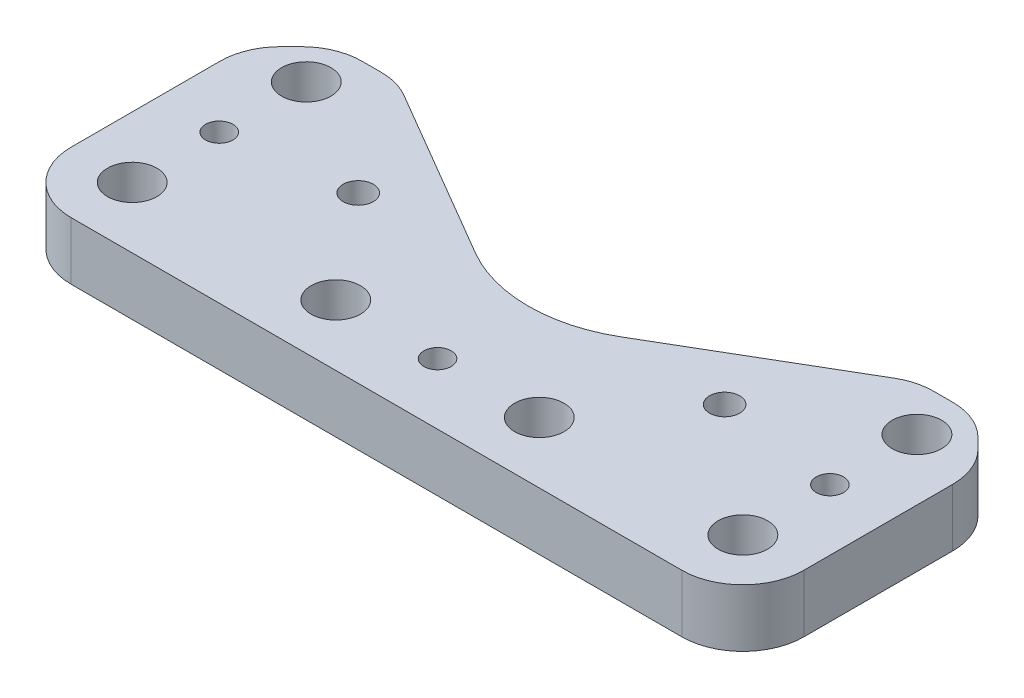
ISO-10303-21;
HEADER;
FILE_DESCRIPTION(('STEP AP214'),'2;1');
FILE_NAME('part.step','',(''),(''),'','','');
FILE_SCHEMA(('AUTOMOTIVE_DESIGN { 1 0 10303 214 1 1 1 1 }'));
ENDSEC;
DATA;
#1=APPLICATION_CONTEXT('core data for automotive mechanical design processes');
#2=APPLICATION_PROTOCOL_DEFINITION('international standard','automotive_design',2000,#1);
#3=PRODUCT_CONTEXT('',#1,'mechanical');
#4=PRODUCT('Part','Part','',(#3));
#5=PRODUCT_RELATED_PRODUCT_CATEGORY('part','',(#4));
#6=PRODUCT_DEFINITION_FORMATION('','',#4);
#7=PRODUCT_DEFINITION_CONTEXT('part definition',#1,'design');
#8=PRODUCT_DEFINITION('design','',#6,#7);
#9=PRODUCT_DEFINITION_SHAPE('','',#8);
#10=(LENGTH_UNIT() NAMED_UNIT(*) SI_UNIT(.MILLI.,.METRE.));
#11=(NAMED_UNIT(*) PLANE_ANGLE_UNIT() SI_UNIT($,.RADIAN.));
#12=(NAMED_UNIT(*) SI_UNIT($,.STERADIAN.) SOLID_ANGLE_UNIT());
#13=UNCERTAINTY_MEASURE_WITH_UNIT(LENGTH_MEASURE(1.E-05),#10,'distance_accuracy_value','');
#14=(GEOMETRIC_REPRESENTATION_CONTEXT(3) GLOBAL_UNCERTAINTY_ASSIGNED_CONTEXT((#13)) GLOBAL_UNIT_ASSIGNED_CONTEXT((#10,
#11,#12)) REPRESENTATION_CONTEXT('',''));
#15=CARTESIAN_POINT('',(0.,0.,0.));
#16=DIRECTION('',(0.,0.,1.));
#17=DIRECTION('',(1.,0.,0.));
#18=AXIS2_PLACEMENT_3D('',#15,#16,#17);
#19=CARTESIAN_POINT('',(38.1,6.,-30.8));
#20=DIRECTION('',(0.,-1.,0.));
#21=DIRECTION('',(0.,0.,-1.));
#22=AXIS2_PLACEMENT_3D('',#19,#20,#21);
#23=CYLINDRICAL_SURFACE('',#22,15.);
#24=DIRECTION('',(0.,-1.,0.));
#25=VECTOR('',#24,1.);
#26=CARTESIAN_POINT('',(30.5243607433017,6.,-17.8535838993036));
#27=LINE('',#26,#25);
#28=CARTESIAN_POINT('',(30.5243607433017,6.,-17.8535838993036));
#29=VERTEX_POINT('',#28);
#30=CARTESIAN_POINT('',(30.5243607433017,0.,-17.8535838993036));
#31=VERTEX_POINT('',#30);
#32=EDGE_CURVE('E174',#29,#31,#27,.T.);
#33=ORIENTED_EDGE('',*,*,#32,.F.);
#34=CARTESIAN_POINT('',(38.1,6.,-30.8));
#35=DIRECTION('',(0.,1.,0.));
#36=DIRECTION('',(0.,0.,1.));
#37=AXIS2_PLACEMENT_3D('',#34,#35,#36);
#38=CIRCLE('',#37,15.);
#39=CARTESIAN_POINT('',(45.6756392566983,6.,-17.8535838993036));
#40=VERTEX_POINT('',#39);
#41=EDGE_CURVE('E183',#29,#40,#38,.T.);
#42=ORIENTED_EDGE('',*,*,#41,.T.);
#43=DIRECTION('',(0.,-1.,0.));
#44=VECTOR('',#43,1.);
#45=CARTESIAN_POINT('',(45.6756392566983,6.,-17.8535838993036));
#46=LINE('',#45,#44);
#47=CARTESIAN_POINT('',(45.6756392566983,0.,-17.8535838993036));
#48=VERTEX_POINT('',#47);
#49=EDGE_CURVE('E163',#40,#48,#46,.T.);
#50=ORIENTED_EDGE('',*,*,#49,.T.);
#51=CARTESIAN_POINT('',(38.1,0.,-30.8));
#52=DIRECTION('',(0.,1.,0.));
#53=DIRECTION('',(0.,0.,1.));
#54=AXIS2_PLACEMENT_3D('',#51,#52,#53);
#55=CIRCLE('',#54,15.);
#56=EDGE_CURVE('E191',#31,#48,#55,.T.);
#57=ORIENTED_EDGE('',*,*,#56,.F.);
#58=EDGE_LOOP('',(#33,#42,#50,#57));
#59=FACE_BOUND('',#58,.T.);
#60=ADVANCED_FACE('F35',(#59),#23,.F.);
#61=CARTESIAN_POINT('',(0.,6.,-50.8));
#62=DIRECTION('',(0.,-1.,0.));
#63=DIRECTION('',(0.,0.,-1.));
#64=AXIS2_PLACEMENT_3D('',#61,#62,#63);
#65=PLANE('',#64);
#66=CARTESIAN_POINT('',(69.85,6.,-15.4));
#67=DIRECTION('',(0.,-1.,0.));
#68=DIRECTION('',(0.,0.,-1.));
#69=AXIS2_PLACEMENT_3D('',#66,#67,#68);
#70=CIRCLE('',#69,1.42);
#71=CARTESIAN_POINT('',(69.85,6.,-16.82));
#72=VERTEX_POINT('',#71);
#73=EDGE_CURVE('E296',#72,#72,#70,.F.);
#74=ORIENTED_EDGE('',*,*,#73,.F.);
#75=EDGE_LOOP('',(#74));
#76=FACE_BOUND('',#75,.T.);
#77=CARTESIAN_POINT('',(38.1,6.,-6.34999999999999));
#78=DIRECTION('',(0.,-1.,0.));
#79=DIRECTION('',(0.,0.,-1.));
#80=AXIS2_PLACEMENT_3D('',#77,#78,#79);
#81=CIRCLE('',#80,1.42);
#82=CARTESIAN_POINT('',(38.1,6.,-7.77));
#83=VERTEX_POINT('',#82);
#84=EDGE_CURVE('E295',#83,#83,#81,.F.);
#85=ORIENTED_EDGE('',*,*,#84,.F.);
#86=EDGE_LOOP('',(#85));
#87=FACE_BOUND('',#86,.T.);
#88=CARTESIAN_POINT('',(6.35,6.,-15.4));
#89=DIRECTION('',(0.,-1.,0.));
#90=DIRECTION('',(0.,0.,-1.));
#91=AXIS2_PLACEMENT_3D('',#88,#89,#90);
#92=CIRCLE('',#91,1.42);
#93=CARTESIAN_POINT('',(6.35,6.,-16.82));
#94=VERTEX_POINT('',#93);
#95=EDGE_CURVE('E302',#94,#94,#92,.F.);
#96=ORIENTED_EDGE('',*,*,#95,.F.);
#97=EDGE_LOOP('',(#96));
#98=FACE_BOUND('',#97,.T.);
#99=CARTESIAN_POINT('',(69.85,6.,-6.34999999999999));
#100=DIRECTION('',(0.,-1.,0.));
#101=DIRECTION('',(0.,0.,-1.));
#102=AXIS2_PLACEMENT_3D('',#99,#100,#101);
#103=CIRCLE('',#102,2.57);
#104=CARTESIAN_POINT('',(69.85,6.,-8.91999999999999));
#105=VERTEX_POINT('',#104);
#106=EDGE_CURVE('E312',#105,#105,#103,.T.);
#107=ORIENTED_EDGE('',*,*,#106,.T.);
#108=EDGE_LOOP('',(#107));
#109=FACE_BOUND('',#108,.T.);
#110=CARTESIAN_POINT('',(27.5166666666667,6.,-6.34999999999999));
#111=DIRECTION('',(0.,-1.,0.));
#112=DIRECTION('',(0.,0.,-1.));
#113=AXIS2_PLACEMENT_3D('',#110,#111,#112);
#114=CIRCLE('',#113,2.57);
#115=CARTESIAN_POINT('',(27.5166666666667,6.,-8.91999999999999));
#116=VERTEX_POINT('',#115);
#117=EDGE_CURVE('E326',#116,#116,#114,.T.);
#118=ORIENTED_EDGE('',*,*,#117,.T.);
#119=EDGE_LOOP('',(#118));
#120=FACE_BOUND('',#119,.T.);
#121=CARTESIAN_POINT('',(6.35000000000001,6.,-24.45));
#122=DIRECTION('',(0.,-1.,0.));
#123=DIRECTION('',(0.,0.,-1.));
#124=AXIS2_PLACEMENT_3D('',#121,#122,#123);
#125=CIRCLE('',#124,2.57);
#126=CARTESIAN_POINT('',(6.35000000000001,6.,-27.02));
#127=VERTEX_POINT('',#126);
#128=EDGE_CURVE('E288',#127,#127,#125,.T.);
#129=ORIENTED_EDGE('',*,*,#128,.T.);
#130=EDGE_LOOP('',(#129));
#131=FACE_BOUND('',#130,.T.);
#132=CARTESIAN_POINT('',(57.15,6.,-17.15));
#133=DIRECTION('',(0.,-1.,0.));
#134=DIRECTION('',(0.,0.,-1.));
#135=AXIS2_PLACEMENT_3D('',#132,#133,#134);
#136=CIRCLE('',#135,1.57);
#137=CARTESIAN_POINT('',(57.15,6.,-18.72));
#138=VERTEX_POINT('',#137);
#139=EDGE_CURVE('E287',#138,#138,#136,.F.);
#140=ORIENTED_EDGE('',*,*,#139,.F.);
#141=EDGE_LOOP('',(#140));
#142=FACE_BOUND('',#141,.T.);
#143=CARTESIAN_POINT('',(19.05,6.,-17.15));
#144=DIRECTION('',(0.,-1.,0.));
#145=DIRECTION('',(0.,0.,-1.));
#146=AXIS2_PLACEMENT_3D('',#143,#144,#145);
#147=CIRCLE('',#146,1.57);
#148=CARTESIAN_POINT('',(19.05,6.,-18.72));
#149=VERTEX_POINT('',#148);
#150=EDGE_CURVE('E39',#149,#149,#147,.F.);
#151=ORIENTED_EDGE('',*,*,#150,.F.);
#152=EDGE_LOOP('',(#151));
#153=FACE_BOUND('',#152,.T.);
#154=DIRECTION('',(0.707106781186547,0.,0.707106781186548));
#155=VECTOR('',#154,1.);
#156=CARTESIAN_POINT('',(63.5,6.,-37.15));
#157=LINE('',#156,#155);
#158=CARTESIAN_POINT('',(73.2973719394654,6.,-27.3526280605346));
#159=VERTEX_POINT('',#158);
#160=CARTESIAN_POINT('',(74.3401280605346,6.,-26.3098719394655));
#161=VERTEX_POINT('',#160);
#162=EDGE_CURVE('E199',#159,#161,#157,.T.);
#163=ORIENTED_EDGE('',*,*,#162,.F.);
#164=CARTESIAN_POINT('',(68.8072438789308,6.,-22.8625000000001));
#165=DIRECTION('',(0.,-1.,0.));
#166=DIRECTION('',(0.,0.,-1.));
#167=AXIS2_PLACEMENT_3D('',#164,#165,#166);
#168=CIRCLE('',#167,6.35);
#169=CARTESIAN_POINT('',(68.8072438789308,6.,-29.2125000000001));
#170=VERTEX_POINT('',#169);
#171=EDGE_CURVE('E262',#159,#170,#168,.F.);
#172=ORIENTED_EDGE('',*,*,#171,.T.);
#173=DIRECTION('',(1.,0.,0.));
#174=VECTOR('',#173,1.);
#175=CARTESIAN_POINT('',(71.4375,6.,-29.2125000000001));
#176=LINE('',#175,#174);
#177=CARTESIAN_POINT('',(66.8088409084979,6.,-29.2125000000001));
#178=VERTEX_POINT('',#177);
#179=EDGE_CURVE('E186',#178,#170,#176,.T.);
#180=ORIENTED_EDGE('',*,*,#179,.F.);
#181=CARTESIAN_POINT('',(66.8088409084979,6.,-22.8625000000001));
#182=DIRECTION('',(0.,-1.,0.));
#183=DIRECTION('',(0.,0.,-1.));
#184=AXIS2_PLACEMENT_3D('',#181,#182,#183);
#185=CIRCLE('',#184,6.35);
#186=CARTESIAN_POINT('',(63.601820289829,6.,-28.3431494826282));
#187=VERTEX_POINT('',#186);
#188=EDGE_CURVE('E185',#178,#187,#185,.F.);
#189=ORIENTED_EDGE('',*,*,#188,.T.);
#190=DIRECTION('',(0.863094406713095,0.,-0.505042617113221));
#191=VECTOR('',#190,1.);
#192=CARTESIAN_POINT('',(65.0875,6.,-29.2125000000001));
#193=LINE('',#192,#191);
#194=EDGE_CURVE('E166',#40,#187,#193,.T.);
#195=ORIENTED_EDGE('',*,*,#194,.F.);
#196=ORIENTED_EDGE('',*,*,#41,.F.);
#197=DIRECTION('',(0.863094406713096,0.,0.505042617113219));
#198=VECTOR('',#197,1.);
#199=CARTESIAN_POINT('',(30.5243607433017,6.,-17.8535838993036));
#200=LINE('',#199,#198);
#201=CARTESIAN_POINT('',(12.598179710171,6.,-28.3431494826282));
#202=VERTEX_POINT('',#201);
#203=EDGE_CURVE('E510',#202,#29,#200,.T.);
#204=ORIENTED_EDGE('',*,*,#203,.F.);
#205=CARTESIAN_POINT('',(9.39115909150207,6.,-22.8625));
#206=DIRECTION('',(0.,-1.,0.));
#207=DIRECTION('',(0.,0.,-1.));
#208=AXIS2_PLACEMENT_3D('',#205,#206,#207);
#209=CIRCLE('',#208,6.35);
#210=CARTESIAN_POINT('',(9.39115909150207,6.,-29.2125));
#211=VERTEX_POINT('',#210);
#212=EDGE_CURVE('E258',#202,#211,#209,.F.);
#213=ORIENTED_EDGE('',*,*,#212,.T.);
#214=DIRECTION('',(1.,0.,0.));
#215=VECTOR('',#214,1.);
#216=CARTESIAN_POINT('',(11.1125,6.,-29.2125));
#217=LINE('',#216,#215);
#218=CARTESIAN_POINT('',(7.39275612106917,6.,-29.2125));
#219=VERTEX_POINT('',#218);
#220=EDGE_CURVE('E527',#219,#211,#217,.T.);
#221=ORIENTED_EDGE('',*,*,#220,.F.);
#222=CARTESIAN_POINT('',(7.39275612106916,6.,-22.8625));
#223=DIRECTION('',(0.,-1.,0.));
#224=DIRECTION('',(0.,0.,-1.));
#225=AXIS2_PLACEMENT_3D('',#222,#223,#224);
#226=CIRCLE('',#225,6.35);
#227=CARTESIAN_POINT('',(2.9026280605346,6.,-27.3526280605346));
#228=VERTEX_POINT('',#227);
#229=EDGE_CURVE('E260',#219,#228,#226,.F.);
#230=ORIENTED_EDGE('',*,*,#229,.T.);
#231=DIRECTION('',(0.707106781186549,0.,-0.707106781186547));
#232=VECTOR('',#231,1.);
#233=CARTESIAN_POINT('',(12.7,6.,-37.15));
#234=LINE('',#233,#232);
#235=CARTESIAN_POINT('',(1.85987193946543,6.,-26.3098719394655));
#236=VERTEX_POINT('',#235);
#237=EDGE_CURVE('E345',#236,#228,#234,.T.);
#238=ORIENTED_EDGE('',*,*,#237,.F.);
#239=CARTESIAN_POINT('',(6.35,6.,-21.8197438789309));
#240=DIRECTION('',(0.,-1.,0.));
#241=DIRECTION('',(0.,0.,-1.));
#242=AXIS2_PLACEMENT_3D('',#239,#240,#241);
#243=CIRCLE('',#242,6.35);
#244=CARTESIAN_POINT('',(0.,6.,-21.8197438789309));
#245=VERTEX_POINT('',#244);
#246=EDGE_CURVE('E238',#236,#245,#243,.F.);
#247=ORIENTED_EDGE('',*,*,#246,.T.);
#248=DIRECTION('',(0.,0.,1.));
#249=VECTOR('',#248,1.);
#250=CARTESIAN_POINT('',(0.,6.,0.));
#251=LINE('',#250,#249);
#252=CARTESIAN_POINT('',(0.,6.,-6.35));
#253=VERTEX_POINT('',#252);
#254=EDGE_CURVE('E202',#245,#253,#251,.T.);
#255=ORIENTED_EDGE('',*,*,#254,.T.);
#256=CARTESIAN_POINT('',(6.35,6.,-6.35));
#257=DIRECTION('',(0.,-1.,0.));
#258=DIRECTION('',(0.,0.,-1.));
#259=AXIS2_PLACEMENT_3D('',#256,#257,#258);
#260=CIRCLE('',#259,6.35);
#261=CARTESIAN_POINT('',(6.35,6.,0.));
#262=VERTEX_POINT('',#261);
#263=EDGE_CURVE('E240',#253,#262,#260,.F.);
#264=ORIENTED_EDGE('',*,*,#263,.T.);
#265=DIRECTION('',(1.,0.,0.));
#266=VECTOR('',#265,1.);
#267=CARTESIAN_POINT('',(0.,6.,0.));
#268=LINE('',#267,#266);
#269=CARTESIAN_POINT('',(69.85,6.,0.));
#270=VERTEX_POINT('',#269);
#271=EDGE_CURVE('E205',#262,#270,#268,.T.);
#272=ORIENTED_EDGE('',*,*,#271,.T.);
#273=CARTESIAN_POINT('',(69.85,6.,-6.35));
#274=DIRECTION('',(0.,-1.,0.));
#275=DIRECTION('',(0.,0.,-1.));
#276=AXIS2_PLACEMENT_3D('',#273,#274,#275);
#277=CIRCLE('',#276,6.35);
#278=CARTESIAN_POINT('',(76.2,6.,-6.35));
#279=VERTEX_POINT('',#278);
#280=EDGE_CURVE('E242',#270,#279,#277,.F.);
#281=ORIENTED_EDGE('',*,*,#280,.T.);
#282=DIRECTION('',(0.,0.,-1.));
#283=VECTOR('',#282,1.);
#284=CARTESIAN_POINT('',(76.2,6.,-50.8));
#285=LINE('',#284,#283);
#286=CARTESIAN_POINT('',(76.2,6.,-21.8197438789309));
#287=VERTEX_POINT('',#286);
#288=EDGE_CURVE('E209',#279,#287,#285,.T.);
#289=ORIENTED_EDGE('',*,*,#288,.T.);
#290=CARTESIAN_POINT('',(69.85,6.,-21.8197438789309));
#291=DIRECTION('',(0.,-1.,0.));
#292=DIRECTION('',(0.,0.,-1.));
#293=AXIS2_PLACEMENT_3D('',#290,#291,#292);
#294=CIRCLE('',#293,6.35);
#295=EDGE_CURVE('E235',#287,#161,#294,.F.);
#296=ORIENTED_EDGE('',*,*,#295,.T.);
#297=EDGE_LOOP('',(#163,#172,#180,#189,#195,#196,#204,#213,#221,#230,#238,#247,#255,#264,#272,
#281,#289,#296));
#298=FACE_BOUND('',#297,.T.);
#299=CARTESIAN_POINT('',(6.35,6.,-6.34999999999999));
#300=DIRECTION('',(0.,-1.,0.));
#301=DIRECTION('',(0.,0.,-1.));
#302=AXIS2_PLACEMENT_3D('',#299,#300,#301);
#303=CIRCLE('',#302,2.57);
#304=CARTESIAN_POINT('',(6.35,6.,-8.91999999999999));
#305=VERTEX_POINT('',#304);
#306=EDGE_CURVE('E332',#305,#305,#303,.T.);
#307=ORIENTED_EDGE('',*,*,#306,.T.);
#308=EDGE_LOOP('',(#307));
#309=FACE_BOUND('',#308,.T.);
#310=CARTESIAN_POINT('',(48.6833333333333,6.,-6.34999999999999));
#311=DIRECTION('',(0.,-1.,0.));
#312=DIRECTION('',(0.,0.,-1.));
#313=AXIS2_PLACEMENT_3D('',#310,#311,#312);
#314=CIRCLE('',#313,2.57);
#315=CARTESIAN_POINT('',(48.6833333333333,6.,-8.91999999999999));
#316=VERTEX_POINT('',#315);
#317=EDGE_CURVE('E320',#316,#316,#314,.T.);
#318=ORIENTED_EDGE('',*,*,#317,.T.);
#319=EDGE_LOOP('',(#318));
#320=FACE_BOUND('',#319,.T.);
#321=CARTESIAN_POINT('',(69.85,6.,-24.45));
#322=DIRECTION('',(0.,-1.,0.));
#323=DIRECTION('',(0.,0.,-1.));
#324=AXIS2_PLACEMENT_3D('',#321,#322,#323);
#325=CIRCLE('',#324,2.57);
#326=CARTESIAN_POINT('',(69.85,6.,-27.02));
#327=VERTEX_POINT('',#326);
#328=EDGE_CURVE('E313',#327,#327,#325,.T.);
#329=ORIENTED_EDGE('',*,*,#328,.T.);
#330=EDGE_LOOP('',(#329));
#331=FACE_BOUND('',#330,.T.);
#332=ADVANCED_FACE('F180',(#76,#87,#98,#109,#120,#131,#142,#153,#298,#309,#320,#331),#65,.F.);
#333=CARTESIAN_POINT('',(0.,0.,-50.8));
#334=DIRECTION('',(0.,-1.,0.));
#335=DIRECTION('',(0.,0.,-1.));
#336=AXIS2_PLACEMENT_3D('',#333,#334,#335);
#337=PLANE('',#336);
#338=CARTESIAN_POINT('',(69.85,0.,-15.4));
#339=DIRECTION('',(0.,-1.,0.));
#340=DIRECTION('',(0.,0.,-1.));
#341=AXIS2_PLACEMENT_3D('',#338,#339,#340);
#342=CIRCLE('',#341,1.42);
#343=CARTESIAN_POINT('',(69.85,0.,-16.82));
#344=VERTEX_POINT('',#343);
#345=EDGE_CURVE('E292',#344,#344,#342,.F.);
#346=ORIENTED_EDGE('',*,*,#345,.T.);
#347=EDGE_LOOP('',(#346));
#348=FACE_BOUND('',#347,.T.);
#349=CARTESIAN_POINT('',(38.1,0.,-6.34999999999999));
#350=DIRECTION('',(0.,-1.,0.));
#351=DIRECTION('',(0.,0.,-1.));
#352=AXIS2_PLACEMENT_3D('',#349,#350,#351);
#353=CIRCLE('',#352,1.42);
#354=CARTESIAN_POINT('',(38.1,0.,-7.77));
#355=VERTEX_POINT('',#354);
#356=EDGE_CURVE('E299',#355,#355,#353,.F.);
#357=ORIENTED_EDGE('',*,*,#356,.T.);
#358=EDGE_LOOP('',(#357));
#359=FACE_BOUND('',#358,.T.);
#360=CARTESIAN_POINT('',(6.35,0.,-15.4));
#361=DIRECTION('',(0.,-1.,0.));
#362=DIRECTION('',(0.,0.,-1.));
#363=AXIS2_PLACEMENT_3D('',#360,#361,#362);
#364=CIRCLE('',#363,1.42);
#365=CARTESIAN_POINT('',(6.35,0.,-16.82));
#366=VERTEX_POINT('',#365);
#367=EDGE_CURVE('E187',#366,#366,#364,.F.);
#368=ORIENTED_EDGE('',*,*,#367,.T.);
#369=EDGE_LOOP('',(#368));
#370=FACE_BOUND('',#369,.T.);
#371=DIRECTION('',(-1.,0.,0.));
#372=VECTOR('',#371,1.);
#373=CARTESIAN_POINT('',(0.,0.,-29.2125000000001));
#374=LINE('',#373,#372);
#375=CARTESIAN_POINT('',(68.8072438789308,0.,-29.2125000000001));
#376=VERTEX_POINT('',#375);
#377=CARTESIAN_POINT('',(66.8088409084979,0.,-29.2125000000001));
#378=VERTEX_POINT('',#377);
#379=EDGE_CURVE('E482',#376,#378,#374,.T.);
#380=ORIENTED_EDGE('',*,*,#379,.F.);
#381=CARTESIAN_POINT('',(68.8072438789308,0.,-22.8625000000001));
#382=DIRECTION('',(0.,-1.,0.));
#383=DIRECTION('',(0.,0.,-1.));
#384=AXIS2_PLACEMENT_3D('',#381,#382,#383);
#385=CIRCLE('',#384,6.35);
#386=CARTESIAN_POINT('',(73.2973719394654,0.,-27.3526280605346));
#387=VERTEX_POINT('',#386);
#388=EDGE_CURVE('E274',#376,#387,#385,.T.);
#389=ORIENTED_EDGE('',*,*,#388,.T.);
#390=DIRECTION('',(0.707106781186547,0.,0.707106781186548));
#391=VECTOR('',#390,1.);
#392=CARTESIAN_POINT('',(63.5,0.,-37.15));
#393=LINE('',#392,#391);
#394=CARTESIAN_POINT('',(74.3401280605346,0.,-26.3098719394655));
#395=VERTEX_POINT('',#394);
#396=EDGE_CURVE('E196',#387,#395,#393,.T.);
#397=ORIENTED_EDGE('',*,*,#396,.T.);
#398=CARTESIAN_POINT('',(69.85,0.,-21.8197438789309));
#399=DIRECTION('',(0.,-1.,0.));
#400=DIRECTION('',(0.,0.,-1.));
#401=AXIS2_PLACEMENT_3D('',#398,#399,#400);
#402=CIRCLE('',#401,6.35);
#403=CARTESIAN_POINT('',(76.2,0.,-21.8197438789309));
#404=VERTEX_POINT('',#403);
#405=EDGE_CURVE('E222',#395,#404,#402,.T.);
#406=ORIENTED_EDGE('',*,*,#405,.T.);
#407=DIRECTION('',(0.,0.,-1.));
#408=VECTOR('',#407,1.);
#409=CARTESIAN_POINT('',(76.2,0.,-50.8));
#410=LINE('',#409,#408);
#411=CARTESIAN_POINT('',(76.2,0.,-6.35));
#412=VERTEX_POINT('',#411);
#413=EDGE_CURVE('E206',#412,#404,#410,.T.);
#414=ORIENTED_EDGE('',*,*,#413,.F.);
#415=CARTESIAN_POINT('',(69.85,0.,-6.35));
#416=DIRECTION('',(0.,-1.,0.));
#417=DIRECTION('',(0.,0.,-1.));
#418=AXIS2_PLACEMENT_3D('',#415,#416,#417);
#419=CIRCLE('',#418,6.35);
#420=CARTESIAN_POINT('',(69.85,0.,0.));
#421=VERTEX_POINT('',#420);
#422=EDGE_CURVE('E228',#412,#421,#419,.T.);
#423=ORIENTED_EDGE('',*,*,#422,.T.);
#424=DIRECTION('',(1.,0.,0.));
#425=VECTOR('',#424,1.);
#426=CARTESIAN_POINT('',(0.,0.,0.));
#427=LINE('',#426,#425);
#428=CARTESIAN_POINT('',(6.35,0.,0.));
#429=VERTEX_POINT('',#428);
#430=EDGE_CURVE('E194',#429,#421,#427,.T.);
#431=ORIENTED_EDGE('',*,*,#430,.F.);
#432=CARTESIAN_POINT('',(6.35,0.,-6.35));
#433=DIRECTION('',(0.,-1.,0.));
#434=DIRECTION('',(0.,0.,-1.));
#435=AXIS2_PLACEMENT_3D('',#432,#433,#434);
#436=CIRCLE('',#435,6.35);
#437=CARTESIAN_POINT('',(0.,0.,-6.35));
#438=VERTEX_POINT('',#437);
#439=EDGE_CURVE('E226',#429,#438,#436,.T.);
#440=ORIENTED_EDGE('',*,*,#439,.T.);
#441=DIRECTION('',(0.,0.,1.));
#442=VECTOR('',#441,1.);
#443=CARTESIAN_POINT('',(0.,0.,0.));
#444=LINE('',#443,#442);
#445=CARTESIAN_POINT('',(0.,0.,-21.8197438789309));
#446=VERTEX_POINT('',#445);
#447=EDGE_CURVE('E190',#446,#438,#444,.T.);
#448=ORIENTED_EDGE('',*,*,#447,.F.);
#449=CARTESIAN_POINT('',(6.35,0.,-21.8197438789309));
#450=DIRECTION('',(0.,-1.,0.));
#451=DIRECTION('',(0.,0.,-1.));
#452=AXIS2_PLACEMENT_3D('',#449,#450,#451);
#453=CIRCLE('',#452,6.35);
#454=CARTESIAN_POINT('',(1.85987193946543,0.,-26.3098719394655));
#455=VERTEX_POINT('',#454);
#456=EDGE_CURVE('E224',#446,#455,#453,.T.);
#457=ORIENTED_EDGE('',*,*,#456,.T.);
#458=DIRECTION('',(0.707106781186549,0.,-0.707106781186547));
#459=VECTOR('',#458,1.);
#460=CARTESIAN_POINT('',(12.7,0.,-37.15));
#461=LINE('',#460,#459);
#462=CARTESIAN_POINT('',(2.9026280605346,0.,-27.3526280605346));
#463=VERTEX_POINT('',#462);
#464=EDGE_CURVE('E517',#455,#463,#461,.T.);
#465=ORIENTED_EDGE('',*,*,#464,.T.);
#466=CARTESIAN_POINT('',(7.39275612106916,0.,-22.8625));
#467=DIRECTION('',(0.,-1.,0.));
#468=DIRECTION('',(0.,0.,-1.));
#469=AXIS2_PLACEMENT_3D('',#466,#467,#468);
#470=CIRCLE('',#469,6.35);
#471=CARTESIAN_POINT('',(7.39275612106917,0.,-29.2125));
#472=VERTEX_POINT('',#471);
#473=EDGE_CURVE('E52',#463,#472,#470,.T.);
#474=ORIENTED_EDGE('',*,*,#473,.T.);
#475=DIRECTION('',(-1.,0.,0.));
#476=VECTOR('',#475,1.);
#477=CARTESIAN_POINT('',(0.,0.,-29.2125));
#478=LINE('',#477,#476);
#479=CARTESIAN_POINT('',(9.39115909150207,0.,-29.2125));
#480=VERTEX_POINT('',#479);
#481=EDGE_CURVE('E509',#480,#472,#478,.T.);
#482=ORIENTED_EDGE('',*,*,#481,.F.);
#483=CARTESIAN_POINT('',(9.39115909150207,0.,-22.8625));
#484=DIRECTION('',(0.,-1.,0.));
#485=DIRECTION('',(0.,0.,-1.));
#486=AXIS2_PLACEMENT_3D('',#483,#484,#485);
#487=CIRCLE('',#486,6.35);
#488=CARTESIAN_POINT('',(12.598179710171,0.,-28.3431494826282));
#489=VERTEX_POINT('',#488);
#490=EDGE_CURVE('E271',#480,#489,#487,.T.);
#491=ORIENTED_EDGE('',*,*,#490,.T.);
#492=DIRECTION('',(-0.863094406713096,0.,-0.505042617113219));
#493=VECTOR('',#492,1.);
#494=CARTESIAN_POINT('',(-6.57553589800984,0.,-39.5627141504354));
#495=LINE('',#494,#493);
#496=EDGE_CURVE('E316',#31,#489,#495,.T.);
#497=ORIENTED_EDGE('',*,*,#496,.F.);
#498=ORIENTED_EDGE('',*,*,#56,.T.);
#499=DIRECTION('',(-0.863094406713095,0.,0.505042617113221));
#500=VECTOR('',#499,1.);
#501=CARTESIAN_POINT('',(26.0117209346734,0.,-6.34717545219455));
#502=LINE('',#501,#500);
#503=CARTESIAN_POINT('',(63.601820289829,0.,-28.3431494826282));
#504=VERTEX_POINT('',#503);
#505=EDGE_CURVE('E169',#504,#48,#502,.T.);
#506=ORIENTED_EDGE('',*,*,#505,.F.);
#507=CARTESIAN_POINT('',(66.8088409084979,0.,-22.8625000000001));
#508=DIRECTION('',(0.,-1.,0.));
#509=DIRECTION('',(0.,0.,-1.));
#510=AXIS2_PLACEMENT_3D('',#507,#508,#509);
#511=CIRCLE('',#510,6.35);
#512=EDGE_CURVE('E269',#504,#378,#511,.T.);
#513=ORIENTED_EDGE('',*,*,#512,.T.);
#514=EDGE_LOOP('',(#380,#389,#397,#406,#414,#423,#431,#440,#448,#457,#465,#474,#482,#491,#497,
#498,#506,#513));
#515=FACE_BOUND('',#514,.T.);
#516=CARTESIAN_POINT('',(69.85,0.,-6.34999999999999));
#517=DIRECTION('',(0.,-1.,0.));
#518=DIRECTION('',(0.,0.,-1.));
#519=AXIS2_PLACEMENT_3D('',#516,#517,#518);
#520=CIRCLE('',#519,2.57);
#521=CARTESIAN_POINT('',(69.85,0.,-8.91999999999999));
#522=VERTEX_POINT('',#521);
#523=EDGE_CURVE('E317',#522,#522,#520,.T.);
#524=ORIENTED_EDGE('',*,*,#523,.F.);
#525=EDGE_LOOP('',(#524));
#526=FACE_BOUND('',#525,.T.);
#527=CARTESIAN_POINT('',(27.5166666666667,0.,-6.34999999999999));
#528=DIRECTION('',(0.,-1.,0.));
#529=DIRECTION('',(0.,0.,-1.));
#530=AXIS2_PLACEMENT_3D('',#527,#528,#529);
#531=CIRCLE('',#530,2.57);
#532=CARTESIAN_POINT('',(27.5166666666667,0.,-8.91999999999999));
#533=VERTEX_POINT('',#532);
#534=EDGE_CURVE('E329',#533,#533,#531,.T.);
#535=ORIENTED_EDGE('',*,*,#534,.F.);
#536=EDGE_LOOP('',(#535));
#537=FACE_BOUND('',#536,.T.);
#538=CARTESIAN_POINT('',(6.35000000000001,0.,-24.45));
#539=DIRECTION('',(0.,-1.,0.));
#540=DIRECTION('',(0.,0.,-1.));
#541=AXIS2_PLACEMENT_3D('',#538,#539,#540);
#542=CIRCLE('',#541,2.57);
#543=CARTESIAN_POINT('',(6.35000000000001,0.,-27.02));
#544=VERTEX_POINT('',#543);
#545=EDGE_CURVE('E284',#544,#544,#542,.T.);
#546=ORIENTED_EDGE('',*,*,#545,.F.);
#547=EDGE_LOOP('',(#546));
#548=FACE_BOUND('',#547,.T.);
#549=CARTESIAN_POINT('',(57.15,0.,-17.15));
#550=DIRECTION('',(0.,-1.,0.));
#551=DIRECTION('',(0.,0.,-1.));
#552=AXIS2_PLACEMENT_3D('',#549,#550,#551);
#553=CIRCLE('',#552,1.57);
#554=CARTESIAN_POINT('',(57.15,0.,-18.72));
#555=VERTEX_POINT('',#554);
#556=EDGE_CURVE('E339',#555,#555,#553,.F.);
#557=ORIENTED_EDGE('',*,*,#556,.T.);
#558=EDGE_LOOP('',(#557));
#559=FACE_BOUND('',#558,.T.);
#560=CARTESIAN_POINT('',(19.05,0.,-17.15));
#561=DIRECTION('',(0.,-1.,0.));
#562=DIRECTION('',(0.,0.,-1.));
#563=AXIS2_PLACEMENT_3D('',#560,#561,#562);
#564=CIRCLE('',#563,1.57);
#565=CARTESIAN_POINT('',(19.05,0.,-18.72));
#566=VERTEX_POINT('',#565);
#567=EDGE_CURVE('E343',#566,#566,#564,.F.);
#568=ORIENTED_EDGE('',*,*,#567,.T.);
#569=EDGE_LOOP('',(#568));
#570=FACE_BOUND('',#569,.T.);
#571=CARTESIAN_POINT('',(6.35,0.,-6.34999999999999));
#572=DIRECTION('',(0.,-1.,0.));
#573=DIRECTION('',(0.,0.,-1.));
#574=AXIS2_PLACEMENT_3D('',#571,#572,#573);
#575=CIRCLE('',#574,2.57);
#576=CARTESIAN_POINT('',(6.35,0.,-8.91999999999999));
#577=VERTEX_POINT('',#576);
#578=EDGE_CURVE('E291',#577,#577,#575,.T.);
#579=ORIENTED_EDGE('',*,*,#578,.F.);
#580=EDGE_LOOP('',(#579));
#581=FACE_BOUND('',#580,.T.);
#582=CARTESIAN_POINT('',(48.6833333333333,0.,-6.34999999999999));
#583=DIRECTION('',(0.,-1.,0.));
#584=DIRECTION('',(0.,0.,-1.));
#585=AXIS2_PLACEMENT_3D('',#582,#583,#584);
#586=CIRCLE('',#585,2.57);
#587=CARTESIAN_POINT('',(48.6833333333333,0.,-8.91999999999999));
#588=VERTEX_POINT('',#587);
#589=EDGE_CURVE('E323',#588,#588,#586,.T.);
#590=ORIENTED_EDGE('',*,*,#589,.F.);
#591=EDGE_LOOP('',(#590));
#592=FACE_BOUND('',#591,.T.);
#593=CARTESIAN_POINT('',(69.85,0.,-24.45));
#594=DIRECTION('',(0.,-1.,0.));
#595=DIRECTION('',(0.,0.,-1.));
#596=AXIS2_PLACEMENT_3D('',#593,#594,#595);
#597=CIRCLE('',#596,2.57);
#598=CARTESIAN_POINT('',(69.85,0.,-27.02));
#599=VERTEX_POINT('',#598);
#600=EDGE_CURVE('E309',#599,#599,#597,.T.);
#601=ORIENTED_EDGE('',*,*,#600,.F.);
#602=EDGE_LOOP('',(#601));
#603=FACE_BOUND('',#602,.T.);
#604=ADVANCED_FACE('F355',(#348,#359,#370,#515,#526,#537,#548,#559,#570,#581,#592,#603),#337,.T.);
#605=CARTESIAN_POINT('',(0.,6.,0.));
#606=DIRECTION('',(1.,0.,0.));
#607=DIRECTION('',(0.,0.,-1.));
#608=AXIS2_PLACEMENT_3D('',#605,#606,#607);
#609=PLANE('',#608);
#610=ORIENTED_EDGE('',*,*,#447,.T.);
#611=DIRECTION('',(0.,-1.,0.));
#612=VECTOR('',#611,1.);
#613=CARTESIAN_POINT('',(0.,6.,-6.35));
#614=LINE('',#613,#612);
#615=EDGE_CURVE('E246',#438,#253,#614,.F.);
#616=ORIENTED_EDGE('',*,*,#615,.T.);
#617=ORIENTED_EDGE('',*,*,#254,.F.);
#618=DIRECTION('',(0.,1.,0.));
#619=VECTOR('',#618,1.);
#620=CARTESIAN_POINT('',(0.,6.,-21.8197438789309));
#621=LINE('',#620,#619);
#622=EDGE_CURVE('E244',#245,#446,#621,.F.);
#623=ORIENTED_EDGE('',*,*,#622,.T.);
#624=EDGE_LOOP('',(#610,#616,#617,#623));
#625=FACE_BOUND('',#624,.T.);
#626=ADVANCED_FACE('F362',(#625),#609,.F.);
#627=CARTESIAN_POINT('',(0.,6.,0.));
#628=DIRECTION('',(0.,0.,-1.));
#629=DIRECTION('',(-1.,0.,0.));
#630=AXIS2_PLACEMENT_3D('',#627,#628,#629);
#631=PLANE('',#630);
#632=ORIENTED_EDGE('',*,*,#430,.T.);
#633=DIRECTION('',(0.,-1.,0.));
#634=VECTOR('',#633,1.);
#635=CARTESIAN_POINT('',(69.85,6.,0.));
#636=LINE('',#635,#634);
#637=EDGE_CURVE('E233',#421,#270,#636,.F.);
#638=ORIENTED_EDGE('',*,*,#637,.T.);
#639=ORIENTED_EDGE('',*,*,#271,.F.);
#640=DIRECTION('',(0.,-1.,0.));
#641=VECTOR('',#640,1.);
#642=CARTESIAN_POINT('',(6.35,6.,0.));
#643=LINE('',#642,#641);
#644=EDGE_CURVE('E230',#262,#429,#643,.T.);
#645=ORIENTED_EDGE('',*,*,#644,.T.);
#646=EDGE_LOOP('',(#632,#638,#639,#645));
#647=FACE_BOUND('',#646,.T.);
#648=ADVANCED_FACE('F374',(#647),#631,.F.);
#649=CARTESIAN_POINT('',(76.2,6.,-50.8));
#650=DIRECTION('',(-1.,0.,0.));
#651=DIRECTION('',(0.,0.,1.));
#652=AXIS2_PLACEMENT_3D('',#649,#650,#651);
#653=PLANE('',#652);
#654=ORIENTED_EDGE('',*,*,#288,.F.);
#655=DIRECTION('',(0.,-1.,0.));
#656=VECTOR('',#655,1.);
#657=CARTESIAN_POINT('',(76.2,6.,-6.35));
#658=LINE('',#657,#656);
#659=EDGE_CURVE('E219',#279,#412,#658,.T.);
#660=ORIENTED_EDGE('',*,*,#659,.T.);
#661=ORIENTED_EDGE('',*,*,#413,.T.);
#662=DIRECTION('',(0.,1.,0.));
#663=VECTOR('',#662,1.);
#664=CARTESIAN_POINT('',(76.2,6.,-21.8197438789309));
#665=LINE('',#664,#663);
#666=EDGE_CURVE('E211',#404,#287,#665,.T.);
#667=ORIENTED_EDGE('',*,*,#666,.T.);
#668=EDGE_LOOP('',(#654,#660,#661,#667));
#669=FACE_BOUND('',#668,.T.);
#670=ADVANCED_FACE('F370',(#669),#653,.F.);
#671=CARTESIAN_POINT('',(12.7,0.,-37.15));
#672=DIRECTION('',(0.707106781186547,0.,0.707106781186549));
#673=DIRECTION('',(0.707106781186549,0.,-0.707106781186547));
#674=AXIS2_PLACEMENT_3D('',#671,#672,#673);
#675=PLANE('',#674);
#676=ORIENTED_EDGE('',*,*,#237,.T.);
#677=DIRECTION('',(0.,1.,0.));
#678=VECTOR('',#677,1.);
#679=CARTESIAN_POINT('',(2.9026280605346,0.,-27.3526280605346));
#680=LINE('',#679,#678);
#681=EDGE_CURVE('E280',#228,#463,#680,.F.);
#682=ORIENTED_EDGE('',*,*,#681,.T.);
#683=ORIENTED_EDGE('',*,*,#464,.F.);
#684=DIRECTION('',(0.,1.,0.));
#685=VECTOR('',#684,1.);
#686=CARTESIAN_POINT('',(1.85987193946543,0.,-26.3098719394655));
#687=LINE('',#686,#685);
#688=EDGE_CURVE('E248',#455,#236,#687,.T.);
#689=ORIENTED_EDGE('',*,*,#688,.T.);
#690=EDGE_LOOP('',(#676,#682,#683,#689));
#691=FACE_BOUND('',#690,.T.);
#692=ADVANCED_FACE('F373',(#691),#675,.F.);
#693=CARTESIAN_POINT('',(63.5,0.,-37.15));
#694=DIRECTION('',(-0.707106781186548,0.,0.707106781186547));
#695=DIRECTION('',(0.707106781186547,0.,0.707106781186548));
#696=AXIS2_PLACEMENT_3D('',#693,#694,#695);
#697=PLANE('',#696);
#698=ORIENTED_EDGE('',*,*,#396,.F.);
#699=DIRECTION('',(0.,1.,0.));
#700=VECTOR('',#699,1.);
#701=CARTESIAN_POINT('',(73.2973719394654,0.,-27.3526280605346));
#702=LINE('',#701,#700);
#703=EDGE_CURVE('E254',#387,#159,#702,.T.);
#704=ORIENTED_EDGE('',*,*,#703,.T.);
#705=ORIENTED_EDGE('',*,*,#162,.T.);
#706=DIRECTION('',(0.,1.,0.));
#707=VECTOR('',#706,1.);
#708=CARTESIAN_POINT('',(74.3401280605346,0.,-26.3098719394655));
#709=LINE('',#708,#707);
#710=EDGE_CURVE('E175',#161,#395,#709,.F.);
#711=ORIENTED_EDGE('',*,*,#710,.T.);
#712=EDGE_LOOP('',(#698,#704,#705,#711));
#713=FACE_BOUND('',#712,.T.);
#714=ADVANCED_FACE('F426',(#713),#697,.F.);
#715=CARTESIAN_POINT('',(19.05,0.,-17.15));
#716=DIRECTION('',(0.,1.,0.));
#717=DIRECTION('',(0.,0.,1.));
#718=AXIS2_PLACEMENT_3D('',#715,#716,#717);
#719=CYLINDRICAL_SURFACE('',#718,1.57);
#720=ORIENTED_EDGE('',*,*,#567,.F.);
#721=EDGE_LOOP('',(#720));
#722=FACE_BOUND('',#721,.T.);
#723=ORIENTED_EDGE('',*,*,#150,.T.);
#724=EDGE_LOOP('',(#723));
#725=FACE_BOUND('',#724,.T.);
#726=ADVANCED_FACE('F352',(#722,#725),#719,.F.);
#727=CARTESIAN_POINT('',(57.15,0.,-17.15));
#728=DIRECTION('',(0.,1.,0.));
#729=DIRECTION('',(0.,0.,1.));
#730=AXIS2_PLACEMENT_3D('',#727,#728,#729);
#731=CYLINDRICAL_SURFACE('',#730,1.57);
#732=ORIENTED_EDGE('',*,*,#556,.F.);
#733=EDGE_LOOP('',(#732));
#734=FACE_BOUND('',#733,.T.);
#735=ORIENTED_EDGE('',*,*,#139,.T.);
#736=EDGE_LOOP('',(#735));
#737=FACE_BOUND('',#736,.T.);
#738=ADVANCED_FACE('F422',(#734,#737),#731,.F.);
#739=CARTESIAN_POINT('',(6.35000000000001,0.,-24.45));
#740=DIRECTION('',(0.,1.,0.));
#741=DIRECTION('',(0.,0.,1.));
#742=AXIS2_PLACEMENT_3D('',#739,#740,#741);
#743=CYLINDRICAL_SURFACE('',#742,2.57);
#744=ORIENTED_EDGE('',*,*,#545,.T.);
#745=EDGE_LOOP('',(#744));
#746=FACE_BOUND('',#745,.T.);
#747=ORIENTED_EDGE('',*,*,#128,.F.);
#748=EDGE_LOOP('',(#747));
#749=FACE_BOUND('',#748,.T.);
#750=ADVANCED_FACE('F418',(#746,#749),#743,.F.);
#751=CARTESIAN_POINT('',(6.35,0.,-6.34999999999999));
#752=DIRECTION('',(0.,1.,0.));
#753=DIRECTION('',(0.,0.,1.));
#754=AXIS2_PLACEMENT_3D('',#751,#752,#753);
#755=CYLINDRICAL_SURFACE('',#754,2.57);
#756=ORIENTED_EDGE('',*,*,#578,.T.);
#757=EDGE_LOOP('',(#756));
#758=FACE_BOUND('',#757,.T.);
#759=ORIENTED_EDGE('',*,*,#306,.F.);
#760=EDGE_LOOP('',(#759));
#761=FACE_BOUND('',#760,.T.);
#762=ADVANCED_FACE('F421',(#758,#761),#755,.F.);
#763=CARTESIAN_POINT('',(27.5166666666667,0.,-6.34999999999999));
#764=DIRECTION('',(0.,1.,0.));
#765=DIRECTION('',(0.,0.,1.));
#766=AXIS2_PLACEMENT_3D('',#763,#764,#765);
#767=CYLINDRICAL_SURFACE('',#766,2.57);
#768=ORIENTED_EDGE('',*,*,#534,.T.);
#769=EDGE_LOOP('',(#768));
#770=FACE_BOUND('',#769,.T.);
#771=ORIENTED_EDGE('',*,*,#117,.F.);
#772=EDGE_LOOP('',(#771));
#773=FACE_BOUND('',#772,.T.);
#774=ADVANCED_FACE('F433',(#770,#773),#767,.F.);
#775=CARTESIAN_POINT('',(48.6833333333333,0.,-6.34999999999999));
#776=DIRECTION('',(0.,1.,0.));
#777=DIRECTION('',(0.,0.,1.));
#778=AXIS2_PLACEMENT_3D('',#775,#776,#777);
#779=CYLINDRICAL_SURFACE('',#778,2.57);
#780=ORIENTED_EDGE('',*,*,#589,.T.);
#781=EDGE_LOOP('',(#780));
#782=FACE_BOUND('',#781,.T.);
#783=ORIENTED_EDGE('',*,*,#317,.F.);
#784=EDGE_LOOP('',(#783));
#785=FACE_BOUND('',#784,.T.);
#786=ADVANCED_FACE('F437',(#782,#785),#779,.F.);
#787=CARTESIAN_POINT('',(69.85,0.,-6.34999999999999));
#788=DIRECTION('',(0.,1.,0.));
#789=DIRECTION('',(0.,0.,1.));
#790=AXIS2_PLACEMENT_3D('',#787,#788,#789);
#791=CYLINDRICAL_SURFACE('',#790,2.57);
#792=ORIENTED_EDGE('',*,*,#523,.T.);
#793=EDGE_LOOP('',(#792));
#794=FACE_BOUND('',#793,.T.);
#795=ORIENTED_EDGE('',*,*,#106,.F.);
#796=EDGE_LOOP('',(#795));
#797=FACE_BOUND('',#796,.T.);
#798=ADVANCED_FACE('F441',(#794,#797),#791,.F.);
#799=CARTESIAN_POINT('',(69.85,0.,-24.45));
#800=DIRECTION('',(0.,1.,0.));
#801=DIRECTION('',(0.,0.,1.));
#802=AXIS2_PLACEMENT_3D('',#799,#800,#801);
#803=CYLINDRICAL_SURFACE('',#802,2.57);
#804=ORIENTED_EDGE('',*,*,#600,.T.);
#805=EDGE_LOOP('',(#804));
#806=FACE_BOUND('',#805,.T.);
#807=ORIENTED_EDGE('',*,*,#328,.F.);
#808=EDGE_LOOP('',(#807));
#809=FACE_BOUND('',#808,.T.);
#810=ADVANCED_FACE('F386',(#806,#809),#803,.F.);
#811=CARTESIAN_POINT('',(69.85,6.,-6.35));
#812=DIRECTION('',(0.,-1.,0.));
#813=DIRECTION('',(0.,0.,-1.));
#814=AXIS2_PLACEMENT_3D('',#811,#812,#813);
#815=CYLINDRICAL_SURFACE('',#814,6.35);
#816=ORIENTED_EDGE('',*,*,#280,.F.);
#817=ORIENTED_EDGE('',*,*,#637,.F.);
#818=ORIENTED_EDGE('',*,*,#422,.F.);
#819=ORIENTED_EDGE('',*,*,#659,.F.);
#820=EDGE_LOOP('',(#816,#817,#818,#819));
#821=FACE_BOUND('',#820,.T.);
#822=ADVANCED_FACE('F382',(#821),#815,.T.);
#823=CARTESIAN_POINT('',(6.35,6.,-6.35));
#824=DIRECTION('',(0.,-1.,0.));
#825=DIRECTION('',(0.,0.,-1.));
#826=AXIS2_PLACEMENT_3D('',#823,#824,#825);
#827=CYLINDRICAL_SURFACE('',#826,6.35);
#828=ORIENTED_EDGE('',*,*,#263,.F.);
#829=ORIENTED_EDGE('',*,*,#615,.F.);
#830=ORIENTED_EDGE('',*,*,#439,.F.);
#831=ORIENTED_EDGE('',*,*,#644,.F.);
#832=EDGE_LOOP('',(#828,#829,#830,#831));
#833=FACE_BOUND('',#832,.T.);
#834=ADVANCED_FACE('F385',(#833),#827,.T.);
#835=CARTESIAN_POINT('',(6.35,0.,-21.8197438789309));
#836=DIRECTION('',(0.,1.,0.));
#837=DIRECTION('',(0.,0.,1.));
#838=AXIS2_PLACEMENT_3D('',#835,#836,#837);
#839=CYLINDRICAL_SURFACE('',#838,6.35);
#840=ORIENTED_EDGE('',*,*,#456,.F.);
#841=ORIENTED_EDGE('',*,*,#622,.F.);
#842=ORIENTED_EDGE('',*,*,#246,.F.);
#843=ORIENTED_EDGE('',*,*,#688,.F.);
#844=EDGE_LOOP('',(#840,#841,#842,#843));
#845=FACE_BOUND('',#844,.T.);
#846=ADVANCED_FACE('F390',(#845),#839,.T.);
#847=CARTESIAN_POINT('',(69.85,6.,-21.8197438789309));
#848=DIRECTION('',(0.,1.,0.));
#849=DIRECTION('',(0.,0.,1.));
#850=AXIS2_PLACEMENT_3D('',#847,#848,#849);
#851=CYLINDRICAL_SURFACE('',#850,6.35);
#852=ORIENTED_EDGE('',*,*,#405,.F.);
#853=ORIENTED_EDGE('',*,*,#710,.F.);
#854=ORIENTED_EDGE('',*,*,#295,.F.);
#855=ORIENTED_EDGE('',*,*,#666,.F.);
#856=EDGE_LOOP('',(#852,#853,#854,#855));
#857=FACE_BOUND('',#856,.T.);
#858=ADVANCED_FACE('F394',(#857),#851,.T.);
#859=CARTESIAN_POINT('',(71.4375,-4.,-29.2125000000001));
#860=DIRECTION('',(0.,0.,1.));
#861=DIRECTION('',(1.,0.,0.));
#862=AXIS2_PLACEMENT_3D('',#859,#860,#861);
#863=PLANE('',#862);
#864=ORIENTED_EDGE('',*,*,#179,.T.);
#865=DIRECTION('',(0.,1.,0.));
#866=VECTOR('',#865,1.);
#867=CARTESIAN_POINT('',(68.8072438789308,-4.,-29.2125000000001));
#868=LINE('',#867,#866);
#869=EDGE_CURVE('E267',#170,#376,#868,.F.);
#870=ORIENTED_EDGE('',*,*,#869,.T.);
#871=ORIENTED_EDGE('',*,*,#379,.T.);
#872=DIRECTION('',(0.,1.,0.));
#873=VECTOR('',#872,1.);
#874=CARTESIAN_POINT('',(66.8088409084979,-4.,-29.2125000000001));
#875=LINE('',#874,#873);
#876=EDGE_CURVE('E264',#378,#178,#875,.T.);
#877=ORIENTED_EDGE('',*,*,#876,.T.);
#878=EDGE_LOOP('',(#864,#870,#871,#877));
#879=FACE_BOUND('',#878,.T.);
#880=ADVANCED_FACE('F398',(#879),#863,.F.);
#881=CARTESIAN_POINT('',(65.0875,-4.,-29.2125000000001));
#882=DIRECTION('',(0.505042617113221,0.,0.863094406713095));
#883=DIRECTION('',(0.863094406713095,0.,-0.505042617113221));
#884=AXIS2_PLACEMENT_3D('',#881,#882,#883);
#885=PLANE('',#884);
#886=ORIENTED_EDGE('',*,*,#194,.T.);
#887=DIRECTION('',(0.,1.,0.));
#888=VECTOR('',#887,1.);
#889=CARTESIAN_POINT('',(63.601820289829,-4.,-28.3431494826282));
#890=LINE('',#889,#888);
#891=EDGE_CURVE('E12',#187,#504,#890,.F.);
#892=ORIENTED_EDGE('',*,*,#891,.T.);
#893=ORIENTED_EDGE('',*,*,#505,.T.);
#894=ORIENTED_EDGE('',*,*,#49,.F.);
#895=EDGE_LOOP('',(#886,#892,#893,#894));
#896=FACE_BOUND('',#895,.T.);
#897=ADVANCED_FACE('F165',(#896),#885,.F.);
#898=CARTESIAN_POINT('',(30.5243607433017,-4.,-17.8535838993036));
#899=DIRECTION('',(-0.505042617113219,0.,0.863094406713096));
#900=DIRECTION('',(0.863094406713096,0.,0.505042617113219));
#901=AXIS2_PLACEMENT_3D('',#898,#899,#900);
#902=PLANE('',#901);
#903=ORIENTED_EDGE('',*,*,#496,.T.);
#904=DIRECTION('',(0.,1.,0.));
#905=VECTOR('',#904,1.);
#906=CARTESIAN_POINT('',(12.598179710171,-4.,-28.3431494826282));
#907=LINE('',#906,#905);
#908=EDGE_CURVE('E44',#489,#202,#907,.T.);
#909=ORIENTED_EDGE('',*,*,#908,.T.);
#910=ORIENTED_EDGE('',*,*,#203,.T.);
#911=ORIENTED_EDGE('',*,*,#32,.T.);
#912=EDGE_LOOP('',(#903,#909,#910,#911));
#913=FACE_BOUND('',#912,.T.);
#914=ADVANCED_FACE('F533',(#913),#902,.F.);
#915=CARTESIAN_POINT('',(11.1125,-4.,-29.2125));
#916=DIRECTION('',(0.,0.,1.));
#917=DIRECTION('',(1.,0.,0.));
#918=AXIS2_PLACEMENT_3D('',#915,#916,#917);
#919=PLANE('',#918);
#920=ORIENTED_EDGE('',*,*,#481,.T.);
#921=DIRECTION('',(0.,1.,0.));
#922=VECTOR('',#921,1.);
#923=CARTESIAN_POINT('',(7.39275612106917,-4.,-29.2125));
#924=LINE('',#923,#922);
#925=EDGE_CURVE('E277',#472,#219,#924,.T.);
#926=ORIENTED_EDGE('',*,*,#925,.T.);
#927=ORIENTED_EDGE('',*,*,#220,.T.);
#928=DIRECTION('',(0.,1.,0.));
#929=VECTOR('',#928,1.);
#930=CARTESIAN_POINT('',(9.39115909150207,-4.,-29.2125));
#931=LINE('',#930,#929);
#932=EDGE_CURVE('E59',#211,#480,#931,.F.);
#933=ORIENTED_EDGE('',*,*,#932,.T.);
#934=EDGE_LOOP('',(#920,#926,#927,#933));
#935=FACE_BOUND('',#934,.T.);
#936=ADVANCED_FACE('F404',(#935),#919,.F.);
#937=CARTESIAN_POINT('',(68.8072438789308,0.,-22.8625000000001));
#938=DIRECTION('',(0.,1.,0.));
#939=DIRECTION('',(0.,0.,1.));
#940=AXIS2_PLACEMENT_3D('',#937,#938,#939);
#941=CYLINDRICAL_SURFACE('',#940,6.35);
#942=ORIENTED_EDGE('',*,*,#388,.F.);
#943=ORIENTED_EDGE('',*,*,#869,.F.);
#944=ORIENTED_EDGE('',*,*,#171,.F.);
#945=ORIENTED_EDGE('',*,*,#703,.F.);
#946=EDGE_LOOP('',(#942,#943,#944,#945));
#947=FACE_BOUND('',#946,.T.);
#948=ADVANCED_FACE('F400',(#947),#941,.T.);
#949=CARTESIAN_POINT('',(7.39275612106916,-4.,-22.8625));
#950=DIRECTION('',(0.,1.,0.));
#951=DIRECTION('',(0.,0.,1.));
#952=AXIS2_PLACEMENT_3D('',#949,#950,#951);
#953=CYLINDRICAL_SURFACE('',#952,6.35);
#954=ORIENTED_EDGE('',*,*,#473,.F.);
#955=ORIENTED_EDGE('',*,*,#681,.F.);
#956=ORIENTED_EDGE('',*,*,#229,.F.);
#957=ORIENTED_EDGE('',*,*,#925,.F.);
#958=EDGE_LOOP('',(#954,#955,#956,#957));
#959=FACE_BOUND('',#958,.T.);
#960=ADVANCED_FACE('F403',(#959),#953,.T.);
#961=CARTESIAN_POINT('',(9.39115909150207,-4.,-22.8625));
#962=DIRECTION('',(0.,1.,0.));
#963=DIRECTION('',(0.,0.,1.));
#964=AXIS2_PLACEMENT_3D('',#961,#962,#963);
#965=CYLINDRICAL_SURFACE('',#964,6.35);
#966=ORIENTED_EDGE('',*,*,#490,.F.);
#967=ORIENTED_EDGE('',*,*,#932,.F.);
#968=ORIENTED_EDGE('',*,*,#212,.F.);
#969=ORIENTED_EDGE('',*,*,#908,.F.);
#970=EDGE_LOOP('',(#966,#967,#968,#969));
#971=FACE_BOUND('',#970,.T.);
#972=ADVANCED_FACE('F408',(#971),#965,.T.);
#973=CARTESIAN_POINT('',(66.8088409084979,-4.,-22.8625000000001));
#974=DIRECTION('',(0.,1.,0.));
#975=DIRECTION('',(0.,0.,1.));
#976=AXIS2_PLACEMENT_3D('',#973,#974,#975);
#977=CYLINDRICAL_SURFACE('',#976,6.35);
#978=ORIENTED_EDGE('',*,*,#512,.F.);
#979=ORIENTED_EDGE('',*,*,#891,.F.);
#980=ORIENTED_EDGE('',*,*,#188,.F.);
#981=ORIENTED_EDGE('',*,*,#876,.F.);
#982=EDGE_LOOP('',(#978,#979,#980,#981));
#983=FACE_BOUND('',#982,.T.);
#984=ADVANCED_FACE('F412',(#983),#977,.T.);
#985=CARTESIAN_POINT('',(6.35,0.,-15.4));
#986=DIRECTION('',(0.,1.,0.));
#987=DIRECTION('',(0.,0.,1.));
#988=AXIS2_PLACEMENT_3D('',#985,#986,#987);
#989=CYLINDRICAL_SURFACE('',#988,1.42);
#990=ORIENTED_EDGE('',*,*,#367,.F.);
#991=EDGE_LOOP('',(#990));
#992=FACE_BOUND('',#991,.T.);
#993=ORIENTED_EDGE('',*,*,#95,.T.);
#994=EDGE_LOOP('',(#993));
#995=FACE_BOUND('',#994,.T.);
#996=ADVANCED_FACE('F416',(#992,#995),#989,.F.);
#997=CARTESIAN_POINT('',(38.1,0.,-6.34999999999999));
#998=DIRECTION('',(0.,1.,0.));
#999=DIRECTION('',(0.,0.,1.));
#1000=AXIS2_PLACEMENT_3D('',#997,#998,#999);
#1001=CYLINDRICAL_SURFACE('',#1000,1.42);
#1002=ORIENTED_EDGE('',*,*,#356,.F.);
#1003=EDGE_LOOP('',(#1002));
#1004=FACE_BOUND('',#1003,.T.);
#1005=ORIENTED_EDGE('',*,*,#84,.T.);
#1006=EDGE_LOOP('',(#1005));
#1007=FACE_BOUND('',#1006,.T.);
#1008=ADVANCED_FACE('F450',(#1004,#1007),#1001,.F.);
#1009=CARTESIAN_POINT('',(69.85,0.,-15.4));
#1010=DIRECTION('',(0.,1.,0.));
#1011=DIRECTION('',(0.,0.,1.));
#1012=AXIS2_PLACEMENT_3D('',#1009,#1010,#1011);
#1013=CYLINDRICAL_SURFACE('',#1012,1.42);
#1014=ORIENTED_EDGE('',*,*,#345,.F.);
#1015=EDGE_LOOP('',(#1014));
#1016=FACE_BOUND('',#1015,.T.);
#1017=ORIENTED_EDGE('',*,*,#73,.T.);
#1018=EDGE_LOOP('',(#1017));
#1019=FACE_BOUND('',#1018,.T.);
#1020=ADVANCED_FACE('F37',(#1016,#1019),#1013,.F.);
#1021=CLOSED_SHELL('',(#60,#332,#604,#626,#648,#670,#692,#714,#726,#738,#750,#762,#774,#786,
#798,#810,#822,#834,#846,#858,#880,#897,#914,#936,#948,#960,#972,#984,#996,#1008,#1020));
#1022=MANIFOLD_SOLID_BREP('B2',#1021);
#1023=ADVANCED_BREP_SHAPE_REPRESENTATION('',(#18,#1022),#14);
#1024=SHAPE_DEFINITION_REPRESENTATION(#9,#1023);
ENDSEC;
END-ISO-10303-21;
